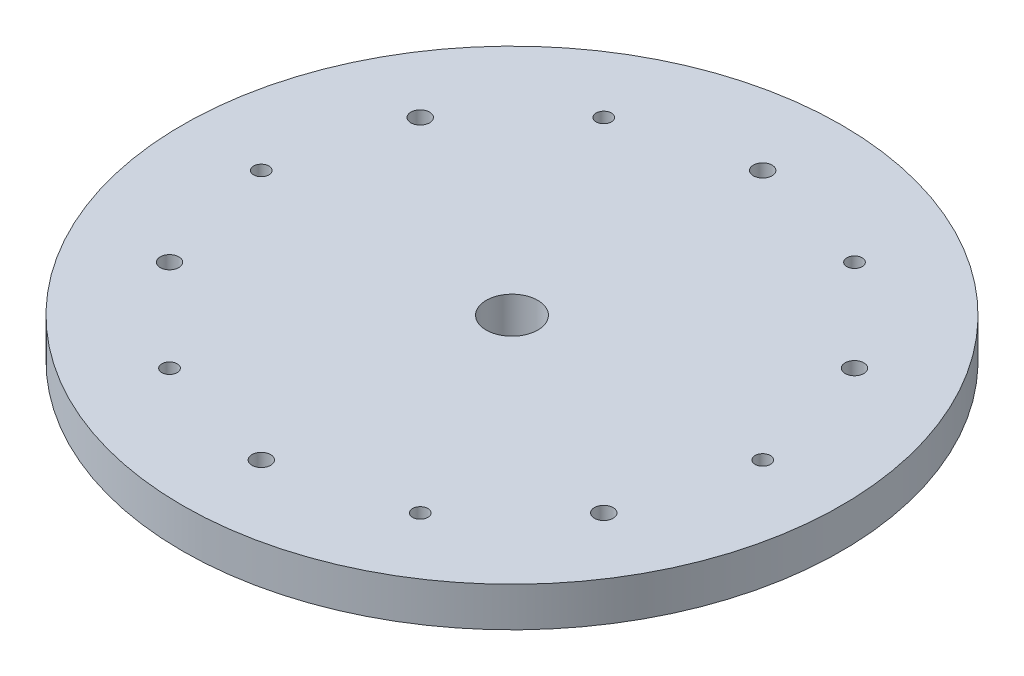
ISO-10303-21;
HEADER;
FILE_DESCRIPTION(('STEP AP214'),'2;1');
FILE_NAME('part.step','',(''),(''),'','','');
FILE_SCHEMA(('AUTOMOTIVE_DESIGN { 1 0 10303 214 1 1 1 1 }'));
ENDSEC;
DATA;
#1=APPLICATION_CONTEXT('core data for automotive mechanical design processes');
#2=APPLICATION_PROTOCOL_DEFINITION('international standard','automotive_design',2000,#1);
#3=PRODUCT_CONTEXT('',#1,'mechanical');
#4=PRODUCT('Part','Part','',(#3));
#5=PRODUCT_RELATED_PRODUCT_CATEGORY('part','',(#4));
#6=PRODUCT_DEFINITION_FORMATION('','',#4);
#7=PRODUCT_DEFINITION_CONTEXT('part definition',#1,'design');
#8=PRODUCT_DEFINITION('design','',#6,#7);
#9=PRODUCT_DEFINITION_SHAPE('','',#8);
#10=(LENGTH_UNIT() NAMED_UNIT(*) SI_UNIT(.MILLI.,.METRE.));
#11=(NAMED_UNIT(*) PLANE_ANGLE_UNIT() SI_UNIT($,.RADIAN.));
#12=(NAMED_UNIT(*) SI_UNIT($,.STERADIAN.) SOLID_ANGLE_UNIT());
#13=UNCERTAINTY_MEASURE_WITH_UNIT(LENGTH_MEASURE(1.E-05),#10,'distance_accuracy_value','');
#14=(GEOMETRIC_REPRESENTATION_CONTEXT(3) GLOBAL_UNCERTAINTY_ASSIGNED_CONTEXT((#13)) GLOBAL_UNIT_ASSIGNED_CONTEXT((#10,
#11,#12)) REPRESENTATION_CONTEXT('',''));
#15=CARTESIAN_POINT('',(0.,0.,0.));
#16=DIRECTION('',(0.,0.,1.));
#17=DIRECTION('',(1.,0.,0.));
#18=AXIS2_PLACEMENT_3D('',#15,#16,#17);
#19=CARTESIAN_POINT('',(0.,6.,0.));
#20=DIRECTION('',(0.,1.,0.));
#21=DIRECTION('',(0.,0.,1.));
#22=AXIS2_PLACEMENT_3D('',#19,#20,#21);
#23=PLANE('',#22);
#24=CARTESIAN_POINT('',(-32.9955678841871,6.,19.05));
#25=DIRECTION('',(0.,1.,0.));
#26=DIRECTION('',(0.,0.,1.));
#27=AXIS2_PLACEMENT_3D('',#24,#25,#26);
#28=CIRCLE('',#27,1.42);
#29=CARTESIAN_POINT('',(-32.9955678841871,6.,20.47));
#30=VERTEX_POINT('',#29);
#31=EDGE_CURVE('E103',#30,#30,#28,.T.);
#32=ORIENTED_EDGE('',*,*,#31,.F.);
#33=EDGE_LOOP('',(#32));
#34=FACE_BOUND('',#33,.T.);
#35=CARTESIAN_POINT('',(32.9955678841871,6.,19.05));
#36=DIRECTION('',(0.,1.,0.));
#37=DIRECTION('',(0.,0.,1.));
#38=AXIS2_PLACEMENT_3D('',#35,#36,#37);
#39=CIRCLE('',#38,1.42);
#40=CARTESIAN_POINT('',(32.9955678841871,6.,20.47));
#41=VERTEX_POINT('',#40);
#42=EDGE_CURVE('E90',#41,#41,#39,.T.);
#43=ORIENTED_EDGE('',*,*,#42,.F.);
#44=EDGE_LOOP('',(#43));
#45=FACE_BOUND('',#44,.T.);
#46=CARTESIAN_POINT('',(0.,6.,0.));
#47=DIRECTION('',(0.,1.,0.));
#48=DIRECTION('',(0.,0.,1.));
#49=AXIS2_PLACEMENT_3D('',#46,#47,#48);
#50=CIRCLE('',#49,3.92);
#51=CARTESIAN_POINT('',(0.,6.,3.92));
#52=VERTEX_POINT('',#51);
#53=EDGE_CURVE('E83',#52,#52,#50,.T.);
#54=ORIENTED_EDGE('',*,*,#53,.F.);
#55=EDGE_LOOP('',(#54));
#56=FACE_BOUND('',#55,.T.);
#57=CARTESIAN_POINT('',(-19.05,6.,-32.9955678841871));
#58=DIRECTION('',(0.,1.,0.));
#59=DIRECTION('',(0.,0.,1.));
#60=AXIS2_PLACEMENT_3D('',#57,#58,#59);
#61=CIRCLE('',#60,1.17);
#62=CARTESIAN_POINT('',(-19.05,6.,-31.8255678841871));
#63=VERTEX_POINT('',#62);
#64=EDGE_CURVE('E71',#63,#63,#61,.T.);
#65=ORIENTED_EDGE('',*,*,#64,.F.);
#66=EDGE_LOOP('',(#65));
#67=FACE_BOUND('',#66,.T.);
#68=CARTESIAN_POINT('',(-19.05,6.,32.9955678841871));
#69=DIRECTION('',(0.,1.,0.));
#70=DIRECTION('',(0.,0.,1.));
#71=AXIS2_PLACEMENT_3D('',#68,#69,#70);
#72=CIRCLE('',#71,1.17);
#73=CARTESIAN_POINT('',(-19.05,6.,34.1655678841871));
#74=VERTEX_POINT('',#73);
#75=EDGE_CURVE('E59',#74,#74,#72,.T.);
#76=ORIENTED_EDGE('',*,*,#75,.F.);
#77=EDGE_LOOP('',(#76));
#78=FACE_BOUND('',#77,.T.);
#79=CARTESIAN_POINT('',(0.,6.,-38.1));
#80=DIRECTION('',(0.,1.,0.));
#81=DIRECTION('',(0.,0.,1.));
#82=AXIS2_PLACEMENT_3D('',#79,#80,#81);
#83=CIRCLE('',#82,1.42);
#84=CARTESIAN_POINT('',(0.,6.,-36.68));
#85=VERTEX_POINT('',#84);
#86=EDGE_CURVE('E47',#85,#85,#83,.T.);
#87=ORIENTED_EDGE('',*,*,#86,.F.);
#88=EDGE_LOOP('',(#87));
#89=FACE_BOUND('',#88,.T.);
#90=CARTESIAN_POINT('',(0.,6.,0.));
#91=DIRECTION('',(0.,1.,0.));
#92=DIRECTION('',(0.,0.,1.));
#93=AXIS2_PLACEMENT_3D('',#90,#91,#92);
#94=CIRCLE('',#93,50.08);
#95=CARTESIAN_POINT('',(0.,6.,50.08));
#96=VERTEX_POINT('',#95);
#97=EDGE_CURVE('E11',#96,#96,#94,.T.);
#98=ORIENTED_EDGE('',*,*,#97,.T.);
#99=EDGE_LOOP('',(#98));
#100=FACE_BOUND('',#99,.T.);
#101=CARTESIAN_POINT('',(38.1,6.,0.));
#102=DIRECTION('',(0.,1.,0.));
#103=DIRECTION('',(0.,0.,1.));
#104=AXIS2_PLACEMENT_3D('',#101,#102,#103);
#105=CIRCLE('',#104,1.17);
#106=CARTESIAN_POINT('',(38.1,6.,1.17));
#107=VERTEX_POINT('',#106);
#108=EDGE_CURVE('E42',#107,#107,#105,.T.);
#109=ORIENTED_EDGE('',*,*,#108,.F.);
#110=EDGE_LOOP('',(#109));
#111=FACE_BOUND('',#110,.T.);
#112=CARTESIAN_POINT('',(19.05,6.,32.9955678841871));
#113=DIRECTION('',(0.,1.,0.));
#114=DIRECTION('',(0.,0.,1.));
#115=AXIS2_PLACEMENT_3D('',#112,#113,#114);
#116=CIRCLE('',#115,1.17);
#117=CARTESIAN_POINT('',(19.05,6.,34.1655678841871));
#118=VERTEX_POINT('',#117);
#119=EDGE_CURVE('E53',#118,#118,#116,.T.);
#120=ORIENTED_EDGE('',*,*,#119,.F.);
#121=EDGE_LOOP('',(#120));
#122=FACE_BOUND('',#121,.T.);
#123=CARTESIAN_POINT('',(-38.1,6.,0.));
#124=DIRECTION('',(0.,1.,0.));
#125=DIRECTION('',(0.,0.,1.));
#126=AXIS2_PLACEMENT_3D('',#123,#124,#125);
#127=CIRCLE('',#126,1.17);
#128=CARTESIAN_POINT('',(-38.1,6.,1.17000000000001));
#129=VERTEX_POINT('',#128);
#130=EDGE_CURVE('E65',#129,#129,#127,.T.);
#131=ORIENTED_EDGE('',*,*,#130,.F.);
#132=EDGE_LOOP('',(#131));
#133=FACE_BOUND('',#132,.T.);
#134=CARTESIAN_POINT('',(19.05,6.,-32.9955678841871));
#135=DIRECTION('',(0.,1.,0.));
#136=DIRECTION('',(0.,0.,1.));
#137=AXIS2_PLACEMENT_3D('',#134,#135,#136);
#138=CIRCLE('',#137,1.17);
#139=CARTESIAN_POINT('',(19.05,6.,-31.8255678841871));
#140=VERTEX_POINT('',#139);
#141=EDGE_CURVE('E77',#140,#140,#138,.T.);
#142=ORIENTED_EDGE('',*,*,#141,.F.);
#143=EDGE_LOOP('',(#142));
#144=FACE_BOUND('',#143,.T.);
#145=CARTESIAN_POINT('',(32.9955678841871,6.,-19.05));
#146=DIRECTION('',(0.,1.,0.));
#147=DIRECTION('',(0.,0.,1.));
#148=AXIS2_PLACEMENT_3D('',#145,#146,#147);
#149=CIRCLE('',#148,1.42);
#150=CARTESIAN_POINT('',(32.9955678841871,6.,-17.63));
#151=VERTEX_POINT('',#150);
#152=EDGE_CURVE('E89',#151,#151,#149,.T.);
#153=ORIENTED_EDGE('',*,*,#152,.F.);
#154=EDGE_LOOP('',(#153));
#155=FACE_BOUND('',#154,.T.);
#156=CARTESIAN_POINT('',(0.,6.,38.1));
#157=DIRECTION('',(0.,1.,0.));
#158=DIRECTION('',(0.,0.,1.));
#159=AXIS2_PLACEMENT_3D('',#156,#157,#158);
#160=CIRCLE('',#159,1.42);
#161=CARTESIAN_POINT('',(0.,6.,39.52));
#162=VERTEX_POINT('',#161);
#163=EDGE_CURVE('E97',#162,#162,#160,.T.);
#164=ORIENTED_EDGE('',*,*,#163,.F.);
#165=EDGE_LOOP('',(#164));
#166=FACE_BOUND('',#165,.T.);
#167=CARTESIAN_POINT('',(-32.9955678841871,6.,-19.05));
#168=DIRECTION('',(0.,1.,0.));
#169=DIRECTION('',(0.,0.,1.));
#170=AXIS2_PLACEMENT_3D('',#167,#168,#169);
#171=CIRCLE('',#170,1.42);
#172=CARTESIAN_POINT('',(-32.9955678841871,6.,-17.63));
#173=VERTEX_POINT('',#172);
#174=EDGE_CURVE('E109',#173,#173,#171,.T.);
#175=ORIENTED_EDGE('',*,*,#174,.F.);
#176=EDGE_LOOP('',(#175));
#177=FACE_BOUND('',#176,.T.);
#178=ADVANCED_FACE('F31',(#34,#45,#56,#67,#78,#89,#100,#111,#122,#133,#144,#155,#166,#177),#23,.T.);
#179=CARTESIAN_POINT('',(0.,0.,0.));
#180=DIRECTION('',(0.,1.,0.));
#181=DIRECTION('',(0.,0.,1.));
#182=AXIS2_PLACEMENT_3D('',#179,#180,#181);
#183=PLANE('',#182);
#184=CARTESIAN_POINT('',(-32.9955678841871,0.,19.05));
#185=DIRECTION('',(0.,1.,0.));
#186=DIRECTION('',(0.,0.,1.));
#187=AXIS2_PLACEMENT_3D('',#184,#185,#186);
#188=CIRCLE('',#187,1.42);
#189=CARTESIAN_POINT('',(-32.9955678841871,0.,20.47));
#190=VERTEX_POINT('',#189);
#191=EDGE_CURVE('E106',#190,#190,#188,.T.);
#192=ORIENTED_EDGE('',*,*,#191,.T.);
#193=EDGE_LOOP('',(#192));
#194=FACE_BOUND('',#193,.T.);
#195=CARTESIAN_POINT('',(32.9955678841871,0.,19.05));
#196=DIRECTION('',(0.,1.,0.));
#197=DIRECTION('',(0.,0.,1.));
#198=AXIS2_PLACEMENT_3D('',#195,#196,#197);
#199=CIRCLE('',#198,1.42);
#200=CARTESIAN_POINT('',(32.9955678841871,0.,20.47));
#201=VERTEX_POINT('',#200);
#202=EDGE_CURVE('E94',#201,#201,#199,.T.);
#203=ORIENTED_EDGE('',*,*,#202,.T.);
#204=EDGE_LOOP('',(#203));
#205=FACE_BOUND('',#204,.T.);
#206=CARTESIAN_POINT('',(0.,0.,0.));
#207=DIRECTION('',(0.,1.,0.));
#208=DIRECTION('',(0.,0.,1.));
#209=AXIS2_PLACEMENT_3D('',#206,#207,#208);
#210=CIRCLE('',#209,3.92);
#211=CARTESIAN_POINT('',(0.,0.,3.92));
#212=VERTEX_POINT('',#211);
#213=EDGE_CURVE('E93',#212,#212,#210,.T.);
#214=ORIENTED_EDGE('',*,*,#213,.T.);
#215=EDGE_LOOP('',(#214));
#216=FACE_BOUND('',#215,.T.);
#217=CARTESIAN_POINT('',(-19.05,0.,-32.9955678841871));
#218=DIRECTION('',(0.,1.,0.));
#219=DIRECTION('',(0.,0.,1.));
#220=AXIS2_PLACEMENT_3D('',#217,#218,#219);
#221=CIRCLE('',#220,1.17);
#222=CARTESIAN_POINT('',(-19.05,0.,-31.8255678841871));
#223=VERTEX_POINT('',#222);
#224=EDGE_CURVE('E74',#223,#223,#221,.T.);
#225=ORIENTED_EDGE('',*,*,#224,.T.);
#226=EDGE_LOOP('',(#225));
#227=FACE_BOUND('',#226,.T.);
#228=CARTESIAN_POINT('',(-19.05,0.,32.9955678841871));
#229=DIRECTION('',(0.,1.,0.));
#230=DIRECTION('',(0.,0.,1.));
#231=AXIS2_PLACEMENT_3D('',#228,#229,#230);
#232=CIRCLE('',#231,1.17);
#233=CARTESIAN_POINT('',(-19.05,0.,34.1655678841871));
#234=VERTEX_POINT('',#233);
#235=EDGE_CURVE('E62',#234,#234,#232,.T.);
#236=ORIENTED_EDGE('',*,*,#235,.T.);
#237=EDGE_LOOP('',(#236));
#238=FACE_BOUND('',#237,.T.);
#239=CARTESIAN_POINT('',(0.,0.,-38.1));
#240=DIRECTION('',(0.,1.,0.));
#241=DIRECTION('',(0.,0.,1.));
#242=AXIS2_PLACEMENT_3D('',#239,#240,#241);
#243=CIRCLE('',#242,1.42);
#244=CARTESIAN_POINT('',(0.,0.,-36.68));
#245=VERTEX_POINT('',#244);
#246=EDGE_CURVE('E50',#245,#245,#243,.T.);
#247=ORIENTED_EDGE('',*,*,#246,.T.);
#248=EDGE_LOOP('',(#247));
#249=FACE_BOUND('',#248,.T.);
#250=CARTESIAN_POINT('',(0.,0.,0.));
#251=DIRECTION('',(0.,1.,0.));
#252=DIRECTION('',(0.,0.,1.));
#253=AXIS2_PLACEMENT_3D('',#250,#251,#252);
#254=CIRCLE('',#253,50.08);
#255=CARTESIAN_POINT('',(0.,0.,50.08));
#256=VERTEX_POINT('',#255);
#257=EDGE_CURVE('E35',#256,#256,#254,.T.);
#258=ORIENTED_EDGE('',*,*,#257,.F.);
#259=EDGE_LOOP('',(#258));
#260=FACE_BOUND('',#259,.T.);
#261=CARTESIAN_POINT('',(38.1,0.,0.));
#262=DIRECTION('',(0.,1.,0.));
#263=DIRECTION('',(0.,0.,1.));
#264=AXIS2_PLACEMENT_3D('',#261,#262,#263);
#265=CIRCLE('',#264,1.17);
#266=CARTESIAN_POINT('',(38.1,0.,1.17));
#267=VERTEX_POINT('',#266);
#268=EDGE_CURVE('E44',#267,#267,#265,.T.);
#269=ORIENTED_EDGE('',*,*,#268,.T.);
#270=EDGE_LOOP('',(#269));
#271=FACE_BOUND('',#270,.T.);
#272=CARTESIAN_POINT('',(19.05,0.,32.9955678841871));
#273=DIRECTION('',(0.,1.,0.));
#274=DIRECTION('',(0.,0.,1.));
#275=AXIS2_PLACEMENT_3D('',#272,#273,#274);
#276=CIRCLE('',#275,1.17);
#277=CARTESIAN_POINT('',(19.05,0.,34.1655678841871));
#278=VERTEX_POINT('',#277);
#279=EDGE_CURVE('E56',#278,#278,#276,.T.);
#280=ORIENTED_EDGE('',*,*,#279,.T.);
#281=EDGE_LOOP('',(#280));
#282=FACE_BOUND('',#281,.T.);
#283=CARTESIAN_POINT('',(-38.1,0.,0.));
#284=DIRECTION('',(0.,1.,0.));
#285=DIRECTION('',(0.,0.,1.));
#286=AXIS2_PLACEMENT_3D('',#283,#284,#285);
#287=CIRCLE('',#286,1.17);
#288=CARTESIAN_POINT('',(-38.1,0.,1.17000000000001));
#289=VERTEX_POINT('',#288);
#290=EDGE_CURVE('E68',#289,#289,#287,.T.);
#291=ORIENTED_EDGE('',*,*,#290,.T.);
#292=EDGE_LOOP('',(#291));
#293=FACE_BOUND('',#292,.T.);
#294=CARTESIAN_POINT('',(19.05,0.,-32.9955678841871));
#295=DIRECTION('',(0.,1.,0.));
#296=DIRECTION('',(0.,0.,1.));
#297=AXIS2_PLACEMENT_3D('',#294,#295,#296);
#298=CIRCLE('',#297,1.17);
#299=CARTESIAN_POINT('',(19.05,0.,-31.8255678841871));
#300=VERTEX_POINT('',#299);
#301=EDGE_CURVE('E80',#300,#300,#298,.T.);
#302=ORIENTED_EDGE('',*,*,#301,.T.);
#303=EDGE_LOOP('',(#302));
#304=FACE_BOUND('',#303,.T.);
#305=CARTESIAN_POINT('',(32.9955678841871,0.,-19.05));
#306=DIRECTION('',(0.,1.,0.));
#307=DIRECTION('',(0.,0.,1.));
#308=AXIS2_PLACEMENT_3D('',#305,#306,#307);
#309=CIRCLE('',#308,1.42);
#310=CARTESIAN_POINT('',(32.9955678841871,0.,-17.63));
#311=VERTEX_POINT('',#310);
#312=EDGE_CURVE('E86',#311,#311,#309,.T.);
#313=ORIENTED_EDGE('',*,*,#312,.T.);
#314=EDGE_LOOP('',(#313));
#315=FACE_BOUND('',#314,.T.);
#316=CARTESIAN_POINT('',(0.,0.,38.1));
#317=DIRECTION('',(0.,1.,0.));
#318=DIRECTION('',(0.,0.,1.));
#319=AXIS2_PLACEMENT_3D('',#316,#317,#318);
#320=CIRCLE('',#319,1.42);
#321=CARTESIAN_POINT('',(0.,0.,39.52));
#322=VERTEX_POINT('',#321);
#323=EDGE_CURVE('E100',#322,#322,#320,.T.);
#324=ORIENTED_EDGE('',*,*,#323,.T.);
#325=EDGE_LOOP('',(#324));
#326=FACE_BOUND('',#325,.T.);
#327=CARTESIAN_POINT('',(-32.9955678841871,0.,-19.05));
#328=DIRECTION('',(0.,1.,0.));
#329=DIRECTION('',(0.,0.,1.));
#330=AXIS2_PLACEMENT_3D('',#327,#328,#329);
#331=CIRCLE('',#330,1.42);
#332=CARTESIAN_POINT('',(-32.9955678841871,0.,-17.63));
#333=VERTEX_POINT('',#332);
#334=EDGE_CURVE('E112',#333,#333,#331,.T.);
#335=ORIENTED_EDGE('',*,*,#334,.T.);
#336=EDGE_LOOP('',(#335));
#337=FACE_BOUND('',#336,.T.);
#338=ADVANCED_FACE('F127',(#194,#205,#216,#227,#238,#249,#260,#271,#282,#293,#304,#315,#326,
#337),#183,.F.);
#339=CARTESIAN_POINT('',(0.,6.,0.));
#340=DIRECTION('',(0.,-1.,0.));
#341=DIRECTION('',(0.,0.,-1.));
#342=AXIS2_PLACEMENT_3D('',#339,#340,#341);
#343=CYLINDRICAL_SURFACE('',#342,50.08);
#344=ORIENTED_EDGE('',*,*,#97,.F.);
#345=EDGE_LOOP('',(#344));
#346=FACE_BOUND('',#345,.T.);
#347=ORIENTED_EDGE('',*,*,#257,.T.);
#348=EDGE_LOOP('',(#347));
#349=FACE_BOUND('',#348,.T.);
#350=ADVANCED_FACE('F156',(#346,#349),#343,.T.);
#351=CARTESIAN_POINT('',(38.1,6.,0.));
#352=DIRECTION('',(0.,-1.,0.));
#353=DIRECTION('',(0.,0.,-1.));
#354=AXIS2_PLACEMENT_3D('',#351,#352,#353);
#355=CYLINDRICAL_SURFACE('',#354,1.17);
#356=ORIENTED_EDGE('',*,*,#108,.T.);
#357=EDGE_LOOP('',(#356));
#358=FACE_BOUND('',#357,.T.);
#359=ORIENTED_EDGE('',*,*,#268,.F.);
#360=EDGE_LOOP('',(#359));
#361=FACE_BOUND('',#360,.T.);
#362=ADVANCED_FACE('F162',(#358,#361),#355,.F.);
#363=CARTESIAN_POINT('',(0.,6.,-38.1));
#364=DIRECTION('',(0.,-1.,0.));
#365=DIRECTION('',(0.,0.,-1.));
#366=AXIS2_PLACEMENT_3D('',#363,#364,#365);
#367=CYLINDRICAL_SURFACE('',#366,1.42);
#368=ORIENTED_EDGE('',*,*,#86,.T.);
#369=EDGE_LOOP('',(#368));
#370=FACE_BOUND('',#369,.T.);
#371=ORIENTED_EDGE('',*,*,#246,.F.);
#372=EDGE_LOOP('',(#371));
#373=FACE_BOUND('',#372,.T.);
#374=ADVANCED_FACE('F173',(#370,#373),#367,.F.);
#375=CARTESIAN_POINT('',(19.05,6.,32.9955678841871));
#376=DIRECTION('',(0.,-1.,0.));
#377=DIRECTION('',(0.,0.,-1.));
#378=AXIS2_PLACEMENT_3D('',#375,#376,#377);
#379=CYLINDRICAL_SURFACE('',#378,1.17);
#380=ORIENTED_EDGE('',*,*,#119,.T.);
#381=EDGE_LOOP('',(#380));
#382=FACE_BOUND('',#381,.T.);
#383=ORIENTED_EDGE('',*,*,#279,.F.);
#384=EDGE_LOOP('',(#383));
#385=FACE_BOUND('',#384,.T.);
#386=ADVANCED_FACE('F177',(#382,#385),#379,.F.);
#387=CARTESIAN_POINT('',(-19.05,6.,32.9955678841871));
#388=DIRECTION('',(0.,-1.,0.));
#389=DIRECTION('',(0.,0.,-1.));
#390=AXIS2_PLACEMENT_3D('',#387,#388,#389);
#391=CYLINDRICAL_SURFACE('',#390,1.17);
#392=ORIENTED_EDGE('',*,*,#75,.T.);
#393=EDGE_LOOP('',(#392));
#394=FACE_BOUND('',#393,.T.);
#395=ORIENTED_EDGE('',*,*,#235,.F.);
#396=EDGE_LOOP('',(#395));
#397=FACE_BOUND('',#396,.T.);
#398=ADVANCED_FACE('F181',(#394,#397),#391,.F.);
#399=CARTESIAN_POINT('',(-38.1,6.,0.));
#400=DIRECTION('',(0.,-1.,0.));
#401=DIRECTION('',(0.,0.,-1.));
#402=AXIS2_PLACEMENT_3D('',#399,#400,#401);
#403=CYLINDRICAL_SURFACE('',#402,1.17);
#404=ORIENTED_EDGE('',*,*,#130,.T.);
#405=EDGE_LOOP('',(#404));
#406=FACE_BOUND('',#405,.T.);
#407=ORIENTED_EDGE('',*,*,#290,.F.);
#408=EDGE_LOOP('',(#407));
#409=FACE_BOUND('',#408,.T.);
#410=ADVANCED_FACE('F185',(#406,#409),#403,.F.);
#411=CARTESIAN_POINT('',(-19.05,6.,-32.9955678841871));
#412=DIRECTION('',(0.,-1.,0.));
#413=DIRECTION('',(0.,0.,-1.));
#414=AXIS2_PLACEMENT_3D('',#411,#412,#413);
#415=CYLINDRICAL_SURFACE('',#414,1.17);
#416=ORIENTED_EDGE('',*,*,#64,.T.);
#417=EDGE_LOOP('',(#416));
#418=FACE_BOUND('',#417,.T.);
#419=ORIENTED_EDGE('',*,*,#224,.F.);
#420=EDGE_LOOP('',(#419));
#421=FACE_BOUND('',#420,.T.);
#422=ADVANCED_FACE('F189',(#418,#421),#415,.F.);
#423=CARTESIAN_POINT('',(19.05,6.,-32.9955678841871));
#424=DIRECTION('',(0.,-1.,0.));
#425=DIRECTION('',(0.,0.,-1.));
#426=AXIS2_PLACEMENT_3D('',#423,#424,#425);
#427=CYLINDRICAL_SURFACE('',#426,1.17);
#428=ORIENTED_EDGE('',*,*,#141,.T.);
#429=EDGE_LOOP('',(#428));
#430=FACE_BOUND('',#429,.T.);
#431=ORIENTED_EDGE('',*,*,#301,.F.);
#432=EDGE_LOOP('',(#431));
#433=FACE_BOUND('',#432,.T.);
#434=ADVANCED_FACE('F169',(#430,#433),#427,.F.);
#435=CARTESIAN_POINT('',(0.,6.,0.));
#436=DIRECTION('',(0.,-1.,0.));
#437=DIRECTION('',(0.,0.,-1.));
#438=AXIS2_PLACEMENT_3D('',#435,#436,#437);
#439=CYLINDRICAL_SURFACE('',#438,3.92);
#440=ORIENTED_EDGE('',*,*,#53,.T.);
#441=EDGE_LOOP('',(#440));
#442=FACE_BOUND('',#441,.T.);
#443=ORIENTED_EDGE('',*,*,#213,.F.);
#444=EDGE_LOOP('',(#443));
#445=FACE_BOUND('',#444,.T.);
#446=ADVANCED_FACE('F122',(#442,#445),#439,.F.);
#447=CARTESIAN_POINT('',(32.9955678841871,6.,-19.05));
#448=DIRECTION('',(0.,-1.,0.));
#449=DIRECTION('',(0.,0.,-1.));
#450=AXIS2_PLACEMENT_3D('',#447,#448,#449);
#451=CYLINDRICAL_SURFACE('',#450,1.42);
#452=ORIENTED_EDGE('',*,*,#152,.T.);
#453=EDGE_LOOP('',(#452));
#454=FACE_BOUND('',#453,.T.);
#455=ORIENTED_EDGE('',*,*,#312,.F.);
#456=EDGE_LOOP('',(#455));
#457=FACE_BOUND('',#456,.T.);
#458=ADVANCED_FACE('F168',(#454,#457),#451,.F.);
#459=CARTESIAN_POINT('',(32.9955678841871,6.,19.05));
#460=DIRECTION('',(0.,-1.,0.));
#461=DIRECTION('',(0.,0.,-1.));
#462=AXIS2_PLACEMENT_3D('',#459,#460,#461);
#463=CYLINDRICAL_SURFACE('',#462,1.42);
#464=ORIENTED_EDGE('',*,*,#42,.T.);
#465=EDGE_LOOP('',(#464));
#466=FACE_BOUND('',#465,.T.);
#467=ORIENTED_EDGE('',*,*,#202,.F.);
#468=EDGE_LOOP('',(#467));
#469=FACE_BOUND('',#468,.T.);
#470=ADVANCED_FACE('F199',(#466,#469),#463,.F.);
#471=CARTESIAN_POINT('',(0.,6.,38.1));
#472=DIRECTION('',(0.,-1.,0.));
#473=DIRECTION('',(0.,0.,-1.));
#474=AXIS2_PLACEMENT_3D('',#471,#472,#473);
#475=CYLINDRICAL_SURFACE('',#474,1.42);
#476=ORIENTED_EDGE('',*,*,#163,.T.);
#477=EDGE_LOOP('',(#476));
#478=FACE_BOUND('',#477,.T.);
#479=ORIENTED_EDGE('',*,*,#323,.F.);
#480=EDGE_LOOP('',(#479));
#481=FACE_BOUND('',#480,.T.);
#482=ADVANCED_FACE('F203',(#478,#481),#475,.F.);
#483=CARTESIAN_POINT('',(-32.9955678841871,6.,19.05));
#484=DIRECTION('',(0.,-1.,0.));
#485=DIRECTION('',(0.,0.,-1.));
#486=AXIS2_PLACEMENT_3D('',#483,#484,#485);
#487=CYLINDRICAL_SURFACE('',#486,1.42);
#488=ORIENTED_EDGE('',*,*,#31,.T.);
#489=EDGE_LOOP('',(#488));
#490=FACE_BOUND('',#489,.T.);
#491=ORIENTED_EDGE('',*,*,#191,.F.);
#492=EDGE_LOOP('',(#491));
#493=FACE_BOUND('',#492,.T.);
#494=ADVANCED_FACE('F152',(#490,#493),#487,.F.);
#495=CARTESIAN_POINT('',(-32.9955678841871,6.,-19.05));
#496=DIRECTION('',(0.,-1.,0.));
#497=DIRECTION('',(0.,0.,-1.));
#498=AXIS2_PLACEMENT_3D('',#495,#496,#497);
#499=CYLINDRICAL_SURFACE('',#498,1.42);
#500=ORIENTED_EDGE('',*,*,#174,.T.);
#501=EDGE_LOOP('',(#500));
#502=FACE_BOUND('',#501,.T.);
#503=ORIENTED_EDGE('',*,*,#334,.F.);
#504=EDGE_LOOP('',(#503));
#505=FACE_BOUND('',#504,.T.);
#506=ADVANCED_FACE('F33',(#502,#505),#499,.F.);
#507=CLOSED_SHELL('',(#178,#338,#350,#362,#374,#386,#398,#410,#422,#434,#446,#458,#470,#482,
#494,#506));
#508=MANIFOLD_SOLID_BREP('B2',#507);
#509=ADVANCED_BREP_SHAPE_REPRESENTATION('',(#18,#508),#14);
#510=SHAPE_DEFINITION_REPRESENTATION(#9,#509);
ENDSEC;
END-ISO-10303-21;
